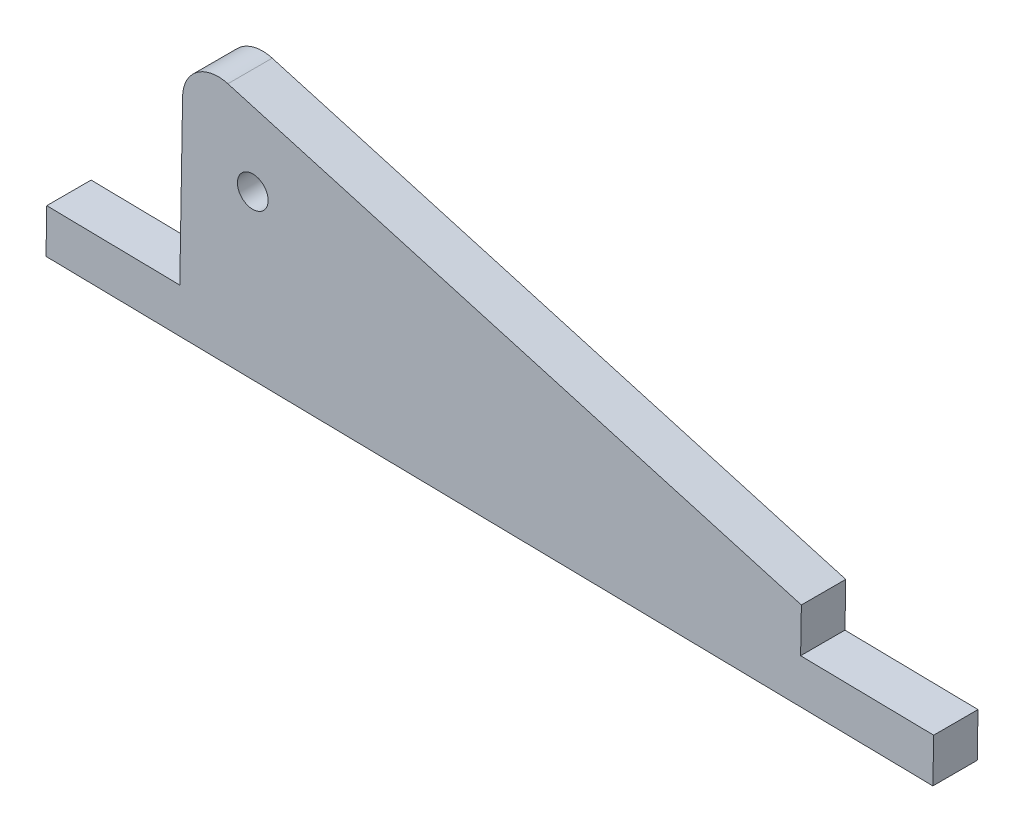
ISO-10303-21;
HEADER;
FILE_DESCRIPTION(('STEP AP214'),'2;1');
FILE_NAME('part.step','',(''),(''),'','','');
FILE_SCHEMA(('AUTOMOTIVE_DESIGN { 1 0 10303 214 1 1 1 1 }'));
ENDSEC;
DATA;
#1=APPLICATION_CONTEXT('core data for automotive mechanical design processes');
#2=APPLICATION_PROTOCOL_DEFINITION('international standard','automotive_design',2000,#1);
#3=PRODUCT_CONTEXT('',#1,'mechanical');
#4=PRODUCT('Part','Part','',(#3));
#5=PRODUCT_RELATED_PRODUCT_CATEGORY('part','',(#4));
#6=PRODUCT_DEFINITION_FORMATION('','',#4);
#7=PRODUCT_DEFINITION_CONTEXT('part definition',#1,'design');
#8=PRODUCT_DEFINITION('design','',#6,#7);
#9=PRODUCT_DEFINITION_SHAPE('','',#8);
#10=(LENGTH_UNIT() NAMED_UNIT(*) SI_UNIT(.MILLI.,.METRE.));
#11=(NAMED_UNIT(*) PLANE_ANGLE_UNIT() SI_UNIT($,.RADIAN.));
#12=(NAMED_UNIT(*) SI_UNIT($,.STERADIAN.) SOLID_ANGLE_UNIT());
#13=UNCERTAINTY_MEASURE_WITH_UNIT(LENGTH_MEASURE(1.E-05),#10,'distance_accuracy_value','');
#14=(GEOMETRIC_REPRESENTATION_CONTEXT(3) GLOBAL_UNCERTAINTY_ASSIGNED_CONTEXT((#13)) GLOBAL_UNIT_ASSIGNED_CONTEXT((#10,
#11,#12)) REPRESENTATION_CONTEXT('',''));
#15=CARTESIAN_POINT('',(0.,0.,0.));
#16=DIRECTION('',(0.,0.,1.));
#17=DIRECTION('',(1.,0.,0.));
#18=AXIS2_PLACEMENT_3D('',#15,#16,#17);
#19=CARTESIAN_POINT('',(-205.973378569321,28.3168947711973,42.8624999999999));
#20=DIRECTION('',(0.999854576670024,-0.0170536070086783,0.));
#21=DIRECTION('',(0.0170536070086783,0.999854576670024,0.));
#22=AXIS2_PLACEMENT_3D('',#19,#20,#21);
#23=PLANE('',#22);
#24=DIRECTION('',(0.,0.,-1.));
#25=VECTOR('',#24,1.);
#26=CARTESIAN_POINT('',(-206.027523771573,25.14235649027,42.8624999999999));
#27=LINE('',#26,#25);
#28=CARTESIAN_POINT('',(-206.027523771573,25.14235649027,42.8624999999999));
#29=VERTEX_POINT('',#28);
#30=CARTESIAN_POINT('',(-206.027523771573,25.14235649027,39.6874999999999));
#31=VERTEX_POINT('',#30);
#32=EDGE_CURVE('E109',#29,#31,#27,.T.);
#33=ORIENTED_EDGE('',*,*,#32,.T.);
#34=DIRECTION('',(-0.0170536070086783,-0.999854576670024,0.));
#35=VECTOR('',#34,1.);
#36=CARTESIAN_POINT('',(-205.973378569321,28.3168947711973,39.6874999999999));
#37=LINE('',#36,#35);
#38=CARTESIAN_POINT('',(-205.973378569321,28.3168947711973,39.6874999999999));
#39=VERTEX_POINT('',#38);
#40=EDGE_CURVE('E112',#39,#31,#37,.T.);
#41=ORIENTED_EDGE('',*,*,#40,.F.);
#42=DIRECTION('',(0.,0.,-1.));
#43=VECTOR('',#42,1.);
#44=CARTESIAN_POINT('',(-205.973378569321,28.3168947711973,42.8624999999999));
#45=LINE('',#44,#43);
#46=CARTESIAN_POINT('',(-205.973378569321,28.3168947711973,42.8624999999999));
#47=VERTEX_POINT('',#46);
#48=EDGE_CURVE('E191',#47,#39,#45,.T.);
#49=ORIENTED_EDGE('',*,*,#48,.F.);
#50=DIRECTION('',(-0.0170536070086783,-0.999854576670024,0.));
#51=VECTOR('',#50,1.);
#52=CARTESIAN_POINT('',(-205.973378569321,28.3168947711973,42.8624999999999));
#53=LINE('',#52,#51);
#54=EDGE_CURVE('E114',#47,#29,#53,.T.);
#55=ORIENTED_EDGE('',*,*,#54,.T.);
#56=EDGE_LOOP('',(#33,#41,#49,#55));
#57=FACE_BOUND('',#56,.T.);
#58=ADVANCED_FACE('F39',(#57),#23,.T.);
#59=CARTESIAN_POINT('',(-205.973378569321,28.3168947711973,42.8624999999999));
#60=DIRECTION('',(0.0170536070086972,0.999854576670024,0.));
#61=DIRECTION('',(-0.999854576670024,0.0170536070086972,0.));
#62=AXIS2_PLACEMENT_3D('',#59,#60,#61);
#63=PLANE('',#62);
#64=ORIENTED_EDGE('',*,*,#48,.T.);
#65=DIRECTION('',(0.999854576670024,-0.0170536070086972,0.));
#66=VECTOR('',#65,1.);
#67=CARTESIAN_POINT('',(-205.973378569321,28.3168947711973,39.6874999999999));
#68=LINE('',#67,#66);
#69=CARTESIAN_POINT('',(-215.496993412103,28.4793303779551,39.6874999999999));
#70=VERTEX_POINT('',#69);
#71=EDGE_CURVE('E135',#70,#39,#68,.T.);
#72=ORIENTED_EDGE('',*,*,#71,.F.);
#73=DIRECTION('',(0.,0.,-1.));
#74=VECTOR('',#73,1.);
#75=CARTESIAN_POINT('',(-215.496993412103,28.4793303779551,42.8624999999999));
#76=LINE('',#75,#74);
#77=CARTESIAN_POINT('',(-215.496993412103,28.4793303779551,42.8624999999999));
#78=VERTEX_POINT('',#77);
#79=EDGE_CURVE('E195',#78,#70,#76,.T.);
#80=ORIENTED_EDGE('',*,*,#79,.F.);
#81=DIRECTION('',(0.999854576670024,-0.0170536070086972,0.));
#82=VECTOR('',#81,1.);
#83=CARTESIAN_POINT('',(-205.973378569321,28.3168947711973,42.8624999999999));
#84=LINE('',#83,#82);
#85=EDGE_CURVE('E120',#78,#47,#84,.T.);
#86=ORIENTED_EDGE('',*,*,#85,.T.);
#87=EDGE_LOOP('',(#64,#72,#80,#86));
#88=FACE_BOUND('',#87,.T.);
#89=ADVANCED_FACE('F237',(#88),#63,.T.);
#90=CARTESIAN_POINT('',(-215.496993412103,28.4793303779551,42.8624999999999));
#91=DIRECTION('',(0.999854576670024,-0.0170536070086685,0.));
#92=DIRECTION('',(0.0170536070086685,0.999854576670025,0.));
#93=AXIS2_PLACEMENT_3D('',#90,#91,#92);
#94=PLANE('',#93);
#95=ORIENTED_EDGE('',*,*,#79,.T.);
#96=DIRECTION('',(-0.0170536070086685,-0.999854576670025,0.));
#97=VECTOR('',#96,1.);
#98=CARTESIAN_POINT('',(-215.496993412103,28.4793303779551,39.6874999999999));
#99=LINE('',#98,#97);
#100=CARTESIAN_POINT('',(-215.442840334729,31.6543303779549,39.6874999999999));
#101=VERTEX_POINT('',#100);
#102=EDGE_CURVE('E155',#101,#70,#99,.T.);
#103=ORIENTED_EDGE('',*,*,#102,.F.);
#104=DIRECTION('',(0.,0.,-1.));
#105=VECTOR('',#104,1.);
#106=CARTESIAN_POINT('',(-215.442840334729,31.6543303779549,42.8624999999999));
#107=LINE('',#106,#105);
#108=CARTESIAN_POINT('',(-215.442840334729,31.6543303779549,42.8624999999999));
#109=VERTEX_POINT('',#108);
#110=EDGE_CURVE('E198',#109,#101,#107,.T.);
#111=ORIENTED_EDGE('',*,*,#110,.F.);
#112=DIRECTION('',(-0.0170536070086685,-0.999854576670025,0.));
#113=VECTOR('',#112,1.);
#114=CARTESIAN_POINT('',(-215.496993412103,28.4793303779551,42.8624999999999));
#115=LINE('',#114,#113);
#116=EDGE_CURVE('E184',#109,#78,#115,.T.);
#117=ORIENTED_EDGE('',*,*,#116,.T.);
#118=EDGE_LOOP('',(#95,#103,#111,#117));
#119=FACE_BOUND('',#118,.T.);
#120=ADVANCED_FACE('F241',(#119),#94,.T.);
#121=CARTESIAN_POINT('',(-259.682693032416,44.3543303779551,42.8624999999998));
#122=DIRECTION('',(0.275926964828723,0.961178604672622,0.));
#123=DIRECTION('',(-0.961178604672622,0.275926964828723,0.));
#124=AXIS2_PLACEMENT_3D('',#121,#122,#123);
#125=PLANE('',#124);
#126=DIRECTION('',(0.961178604672622,-0.275926964828723,0.));
#127=VECTOR('',#126,1.);
#128=CARTESIAN_POINT('',(-259.682693032416,44.3543303779551,39.6874999999998));
#129=LINE('',#128,#127);
#130=CARTESIAN_POINT('',(-256.498699575141,43.4402966630664,39.6874999999998));
#131=VERTEX_POINT('',#130);
#132=EDGE_CURVE('E152',#131,#101,#129,.T.);
#133=ORIENTED_EDGE('',*,*,#132,.F.);
#134=DIRECTION('',(0.,0.,-1.));
#135=VECTOR('',#134,1.);
#136=CARTESIAN_POINT('',(-256.498699575141,43.4402966630664,42.8624999999998));
#137=LINE('',#136,#135);
#138=CARTESIAN_POINT('',(-256.498699575141,43.4402966630664,42.8624999999998));
#139=VERTEX_POINT('',#138);
#140=EDGE_CURVE('E48',#131,#139,#137,.F.);
#141=ORIENTED_EDGE('',*,*,#140,.T.);
#142=DIRECTION('',(0.961178604672622,-0.275926964828723,0.));
#143=VECTOR('',#142,1.);
#144=CARTESIAN_POINT('',(-259.682693032416,44.3543303779551,42.8624999999998));
#145=LINE('',#144,#143);
#146=EDGE_CURVE('E181',#139,#109,#145,.T.);
#147=ORIENTED_EDGE('',*,*,#146,.T.);
#148=ORIENTED_EDGE('',*,*,#110,.T.);
#149=EDGE_LOOP('',(#133,#141,#147,#148));
#150=FACE_BOUND('',#149,.T.);
#151=ADVANCED_FACE('F255',(#150),#125,.T.);
#152=CARTESIAN_POINT('',(-259.886376267712,32.4123632094904,42.8624999999998));
#153=DIRECTION('',(-0.999854576670024,0.0170536070086762,0.));
#154=DIRECTION('',(-0.0170536070086763,-0.999854576670025,0.));
#155=AXIS2_PLACEMENT_3D('',#152,#153,#154);
#156=PLANE('',#155);
#157=DIRECTION('',(0.0170536070086586,0.999854576670025,0.));
#158=VECTOR('',#157,1.);
#159=CARTESIAN_POINT('',(-259.940529345085,29.2373632094904,42.8624999999998));
#160=LINE('',#159,#158);
#161=CARTESIAN_POINT('',(-259.940529345085,29.2373632094904,42.8624999999998));
#162=VERTEX_POINT('',#161);
#163=CARTESIAN_POINT('',(-259.739184690548,41.042219169,42.8624999999998));
#164=VERTEX_POINT('',#163);
#165=EDGE_CURVE('E177',#162,#164,#160,.T.);
#166=ORIENTED_EDGE('',*,*,#165,.T.);
#167=DIRECTION('',(0.,0.,-1.));
#168=VECTOR('',#167,1.);
#169=CARTESIAN_POINT('',(-259.739184690548,41.042219169,42.8624999999998));
#170=LINE('',#169,#168);
#171=CARTESIAN_POINT('',(-259.739184690548,41.042219169,39.6874999999998));
#172=VERTEX_POINT('',#171);
#173=EDGE_CURVE('E194',#164,#172,#170,.T.);
#174=ORIENTED_EDGE('',*,*,#173,.T.);
#175=DIRECTION('',(0.0170536070086586,0.999854576670025,0.));
#176=VECTOR('',#175,1.);
#177=CARTESIAN_POINT('',(-259.940529345085,29.2373632094904,39.6874999999998));
#178=LINE('',#177,#176);
#179=CARTESIAN_POINT('',(-259.940529345085,29.2373632094904,39.6874999999998));
#180=VERTEX_POINT('',#179);
#181=EDGE_CURVE('E149',#180,#172,#178,.T.);
#182=ORIENTED_EDGE('',*,*,#181,.F.);
#183=DIRECTION('',(0.,0.,-1.));
#184=VECTOR('',#183,1.);
#185=CARTESIAN_POINT('',(-259.940529345085,29.2373632094904,42.8624999999998));
#186=LINE('',#185,#184);
#187=EDGE_CURVE('E202',#162,#180,#186,.T.);
#188=ORIENTED_EDGE('',*,*,#187,.F.);
#189=EDGE_LOOP('',(#166,#174,#182,#188));
#190=FACE_BOUND('',#189,.T.);
#191=ADVANCED_FACE('F218',(#190),#156,.T.);
#192=CARTESIAN_POINT('',(-259.940529345085,29.2373632094904,42.8624999999998));
#193=DIRECTION('',(0.0170536070086971,0.999854576670024,0.));
#194=DIRECTION('',(-0.999854576670024,0.0170536070086971,0.));
#195=AXIS2_PLACEMENT_3D('',#192,#193,#194);
#196=PLANE('',#195);
#197=ORIENTED_EDGE('',*,*,#187,.T.);
#198=DIRECTION('',(0.999854576670024,-0.0170536070086971,0.));
#199=VECTOR('',#198,1.);
#200=CARTESIAN_POINT('',(-259.940529345085,29.2373632094904,39.6874999999998));
#201=LINE('',#200,#199);
#202=CARTESIAN_POINT('',(-269.464144187867,29.3997988162482,39.6874999999998));
#203=VERTEX_POINT('',#202);
#204=EDGE_CURVE('E145',#203,#180,#201,.T.);
#205=ORIENTED_EDGE('',*,*,#204,.F.);
#206=DIRECTION('',(0.,0.,-1.));
#207=VECTOR('',#206,1.);
#208=CARTESIAN_POINT('',(-269.464144187867,29.3997988162482,42.8624999999998));
#209=LINE('',#208,#207);
#210=CARTESIAN_POINT('',(-269.464144187867,29.3997988162482,42.8624999999998));
#211=VERTEX_POINT('',#210);
#212=EDGE_CURVE('E205',#211,#203,#209,.T.);
#213=ORIENTED_EDGE('',*,*,#212,.F.);
#214=DIRECTION('',(0.999854576670024,-0.0170536070086971,0.));
#215=VECTOR('',#214,1.);
#216=CARTESIAN_POINT('',(-259.940529345085,29.2373632094904,42.8624999999998));
#217=LINE('',#216,#215);
#218=EDGE_CURVE('E173',#211,#162,#217,.T.);
#219=ORIENTED_EDGE('',*,*,#218,.T.);
#220=EDGE_LOOP('',(#197,#205,#213,#219));
#221=FACE_BOUND('',#220,.T.);
#222=ADVANCED_FACE('F224',(#221),#196,.T.);
#223=CARTESIAN_POINT('',(-269.464144187867,29.3997988162482,42.8624999999998));
#224=DIRECTION('',(-0.999854576670024,0.0170536070086783,0.));
#225=DIRECTION('',(-0.0170536070086783,-0.999854576670024,0.));
#226=AXIS2_PLACEMENT_3D('',#223,#224,#225);
#227=PLANE('',#226);
#228=ORIENTED_EDGE('',*,*,#212,.T.);
#229=DIRECTION('',(0.0170536070086783,0.999854576670024,0.));
#230=VECTOR('',#229,1.);
#231=CARTESIAN_POINT('',(-269.464144187867,29.3997988162482,39.6874999999998));
#232=LINE('',#231,#230);
#233=CARTESIAN_POINT('',(-269.51828939012,26.2252605353209,39.6874999999998));
#234=VERTEX_POINT('',#233);
#235=EDGE_CURVE('E128',#234,#203,#232,.T.);
#236=ORIENTED_EDGE('',*,*,#235,.F.);
#237=DIRECTION('',(0.,0.,-1.));
#238=VECTOR('',#237,1.);
#239=CARTESIAN_POINT('',(-269.51828939012,26.2252605353209,42.8624999999998));
#240=LINE('',#239,#238);
#241=CARTESIAN_POINT('',(-269.51828939012,26.2252605353209,42.8624999999998));
#242=VERTEX_POINT('',#241);
#243=EDGE_CURVE('E119',#242,#234,#240,.T.);
#244=ORIENTED_EDGE('',*,*,#243,.F.);
#245=DIRECTION('',(0.0170536070086783,0.999854576670024,0.));
#246=VECTOR('',#245,1.);
#247=CARTESIAN_POINT('',(-269.464144187867,29.3997988162482,42.8624999999998));
#248=LINE('',#247,#246);
#249=EDGE_CURVE('E169',#242,#211,#248,.T.);
#250=ORIENTED_EDGE('',*,*,#249,.T.);
#251=EDGE_LOOP('',(#228,#236,#244,#250));
#252=FACE_BOUND('',#251,.T.);
#253=ADVANCED_FACE('F247',(#252),#227,.T.);
#254=CARTESIAN_POINT('',(-206.027523771573,25.14235649027,42.8624999999999));
#255=DIRECTION('',(-0.0170536070086766,-0.999854576670024,0.));
#256=DIRECTION('',(0.999854576670024,-0.0170536070086766,0.));
#257=AXIS2_PLACEMENT_3D('',#254,#255,#256);
#258=PLANE('',#257);
#259=ORIENTED_EDGE('',*,*,#243,.T.);
#260=DIRECTION('',(-0.999854576670024,0.0170536070086766,0.));
#261=VECTOR('',#260,1.);
#262=CARTESIAN_POINT('',(-206.027523771573,25.14235649027,39.6874999999999));
#263=LINE('',#262,#261);
#264=EDGE_CURVE('E123',#31,#234,#263,.T.);
#265=ORIENTED_EDGE('',*,*,#264,.F.);
#266=ORIENTED_EDGE('',*,*,#32,.F.);
#267=DIRECTION('',(-0.999854576670024,0.0170536070086766,0.));
#268=VECTOR('',#267,1.);
#269=CARTESIAN_POINT('',(-206.027523771573,25.14235649027,42.8624999999999));
#270=LINE('',#269,#268);
#271=EDGE_CURVE('E166',#29,#242,#270,.T.);
#272=ORIENTED_EDGE('',*,*,#271,.T.);
#273=EDGE_LOOP('',(#259,#265,#266,#272));
#274=FACE_BOUND('',#273,.T.);
#275=ADVANCED_FACE('F124',(#274),#258,.T.);
#276=CARTESIAN_POINT('',(0.,0.,42.8625));
#277=DIRECTION('',(0.,0.,-1.));
#278=DIRECTION('',(0.,1.,0.));
#279=AXIS2_PLACEMENT_3D('',#276,#277,#278);
#280=PLANE('',#279);
#281=CARTESIAN_POINT('',(-254.716415099196,37.6434756364406,42.8624999999998));
#282=DIRECTION('',(0.,0.,-1.));
#283=DIRECTION('',(-1.,0.,0.));
#284=AXIS2_PLACEMENT_3D('',#281,#282,#283);
#285=CIRCLE('',#284,1.09999999999999);
#286=CARTESIAN_POINT('',(-255.816415099196,37.6434756364406,42.8624999999998));
#287=VERTEX_POINT('',#286);
#288=EDGE_CURVE('E160',#287,#287,#285,.T.);
#289=ORIENTED_EDGE('',*,*,#288,.T.);
#290=EDGE_LOOP('',(#289));
#291=FACE_BOUND('',#290,.T.);
#292=ORIENTED_EDGE('',*,*,#146,.F.);
#293=CARTESIAN_POINT('',(-257.199554065806,40.9989030071979,42.8624999999999));
#294=DIRECTION('',(0.,0.,-1.));
#295=DIRECTION('',(0.,1.,0.));
#296=AXIS2_PLACEMENT_3D('',#293,#294,#295);
#297=CIRCLE('',#296,2.54);
#298=EDGE_CURVE('E11',#139,#164,#297,.F.);
#299=ORIENTED_EDGE('',*,*,#298,.T.);
#300=ORIENTED_EDGE('',*,*,#165,.F.);
#301=ORIENTED_EDGE('',*,*,#218,.F.);
#302=ORIENTED_EDGE('',*,*,#249,.F.);
#303=ORIENTED_EDGE('',*,*,#271,.F.);
#304=ORIENTED_EDGE('',*,*,#54,.F.);
#305=ORIENTED_EDGE('',*,*,#85,.F.);
#306=ORIENTED_EDGE('',*,*,#116,.F.);
#307=EDGE_LOOP('',(#292,#299,#300,#301,#302,#303,#304,#305,#306));
#308=FACE_BOUND('',#307,.T.);
#309=ADVANCED_FACE('F227',(#291,#308),#280,.F.);
#310=CARTESIAN_POINT('',(-254.716415099196,37.6434756364406,42.8624999999998));
#311=DIRECTION('',(0.,0.,-1.));
#312=DIRECTION('',(-1.,0.,0.));
#313=AXIS2_PLACEMENT_3D('',#310,#311,#312);
#314=CYLINDRICAL_SURFACE('',#313,1.09999999999999);
#315=ORIENTED_EDGE('',*,*,#288,.F.);
#316=EDGE_LOOP('',(#315));
#317=FACE_BOUND('',#316,.T.);
#318=CARTESIAN_POINT('',(-254.716415099196,37.6434756364406,39.6874999999998));
#319=DIRECTION('',(0.,0.,-1.));
#320=DIRECTION('',(-1.,0.,0.));
#321=AXIS2_PLACEMENT_3D('',#318,#319,#320);
#322=CIRCLE('',#321,1.09999999999999);
#323=CARTESIAN_POINT('',(-255.816415099196,37.6434756364406,39.6874999999998));
#324=VERTEX_POINT('',#323);
#325=EDGE_CURVE('E137',#324,#324,#322,.T.);
#326=ORIENTED_EDGE('',*,*,#325,.T.);
#327=EDGE_LOOP('',(#326));
#328=FACE_BOUND('',#327,.T.);
#329=ADVANCED_FACE('F234',(#317,#328),#314,.F.);
#330=CARTESIAN_POINT('',(0.,0.,39.6875));
#331=DIRECTION('',(0.,0.,-1.));
#332=DIRECTION('',(0.,1.,0.));
#333=AXIS2_PLACEMENT_3D('',#330,#331,#332);
#334=PLANE('',#333);
#335=ORIENTED_EDGE('',*,*,#181,.T.);
#336=CARTESIAN_POINT('',(-257.199554065806,40.9989030071979,39.6874999999999));
#337=DIRECTION('',(0.,0.,-1.));
#338=DIRECTION('',(0.,1.,0.));
#339=AXIS2_PLACEMENT_3D('',#336,#337,#338);
#340=CIRCLE('',#339,2.54);
#341=EDGE_CURVE('E62',#172,#131,#340,.T.);
#342=ORIENTED_EDGE('',*,*,#341,.T.);
#343=ORIENTED_EDGE('',*,*,#132,.T.);
#344=ORIENTED_EDGE('',*,*,#102,.T.);
#345=ORIENTED_EDGE('',*,*,#71,.T.);
#346=ORIENTED_EDGE('',*,*,#40,.T.);
#347=ORIENTED_EDGE('',*,*,#264,.T.);
#348=ORIENTED_EDGE('',*,*,#235,.T.);
#349=ORIENTED_EDGE('',*,*,#204,.T.);
#350=EDGE_LOOP('',(#335,#342,#343,#344,#345,#346,#347,#348,#349));
#351=FACE_BOUND('',#350,.T.);
#352=ORIENTED_EDGE('',*,*,#325,.F.);
#353=EDGE_LOOP('',(#352));
#354=FACE_BOUND('',#353,.T.);
#355=ADVANCED_FACE('F131',(#351,#354),#334,.T.);
#356=CARTESIAN_POINT('',(-257.199554065806,40.9989030071979,42.8624999999998));
#357=DIRECTION('',(0.,0.,-1.));
#358=DIRECTION('',(-1.,0.,0.));
#359=AXIS2_PLACEMENT_3D('',#356,#357,#358);
#360=CYLINDRICAL_SURFACE('',#359,2.54);
#361=ORIENTED_EDGE('',*,*,#298,.F.);
#362=ORIENTED_EDGE('',*,*,#140,.F.);
#363=ORIENTED_EDGE('',*,*,#341,.F.);
#364=ORIENTED_EDGE('',*,*,#173,.F.);
#365=EDGE_LOOP('',(#361,#362,#363,#364));
#366=FACE_BOUND('',#365,.T.);
#367=ADVANCED_FACE('F41',(#366),#360,.T.);
#368=CLOSED_SHELL('',(#58,#89,#120,#151,#191,#222,#253,#275,#309,#329,#355,#367));
#369=MANIFOLD_SOLID_BREP('B2',#368);
#370=ADVANCED_BREP_SHAPE_REPRESENTATION('',(#18,#369),#14);
#371=SHAPE_DEFINITION_REPRESENTATION(#9,#370);
ENDSEC;
END-ISO-10303-21;
